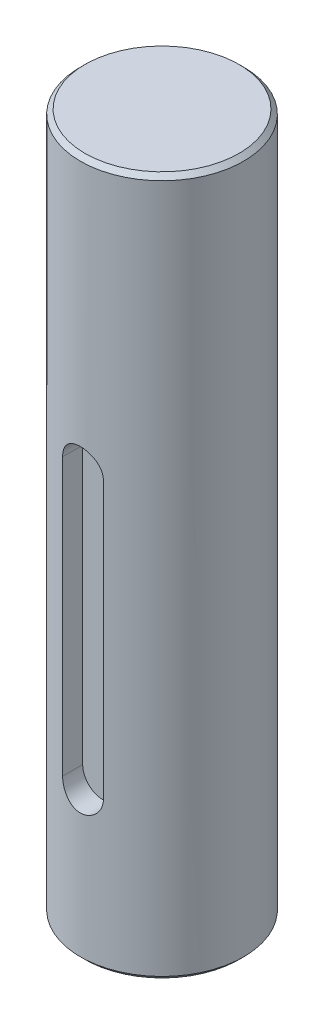
ISO-10303-21;
HEADER;
FILE_DESCRIPTION(('STEP AP214'),'2;1');
FILE_NAME('part.step','',(''),(''),'','','');
FILE_SCHEMA(('AUTOMOTIVE_DESIGN { 1 0 10303 214 1 1 1 1 }'));
ENDSEC;
DATA;
#1=APPLICATION_CONTEXT('core data for automotive mechanical design processes');
#2=APPLICATION_PROTOCOL_DEFINITION('international standard','automotive_design',2000,#1);
#3=PRODUCT_CONTEXT('',#1,'mechanical');
#4=PRODUCT('Part','Part','',(#3));
#5=PRODUCT_RELATED_PRODUCT_CATEGORY('part','',(#4));
#6=PRODUCT_DEFINITION_FORMATION('','',#4);
#7=PRODUCT_DEFINITION_CONTEXT('part definition',#1,'design');
#8=PRODUCT_DEFINITION('design','',#6,#7);
#9=PRODUCT_DEFINITION_SHAPE('','',#8);
#10=(LENGTH_UNIT() NAMED_UNIT(*) SI_UNIT(.MILLI.,.METRE.));
#11=(NAMED_UNIT(*) PLANE_ANGLE_UNIT() SI_UNIT($,.RADIAN.));
#12=(NAMED_UNIT(*) SI_UNIT($,.STERADIAN.) SOLID_ANGLE_UNIT());
#13=UNCERTAINTY_MEASURE_WITH_UNIT(LENGTH_MEASURE(1.E-05),#10,'distance_accuracy_value','');
#14=(GEOMETRIC_REPRESENTATION_CONTEXT(3) GLOBAL_UNCERTAINTY_ASSIGNED_CONTEXT((#13)) GLOBAL_UNIT_ASSIGNED_CONTEXT((#10,
#11,#12)) REPRESENTATION_CONTEXT('',''));
#15=CARTESIAN_POINT('',(0.,0.,0.));
#16=DIRECTION('',(0.,0.,1.));
#17=DIRECTION('',(1.,0.,0.));
#18=AXIS2_PLACEMENT_3D('',#15,#16,#17);
#19=CARTESIAN_POINT('',(0.,154.,0.));
#20=DIRECTION('',(0.,-1.,0.));
#21=DIRECTION('',(0.,0.,-1.));
#22=AXIS2_PLACEMENT_3D('',#19,#20,#21);
#23=CYLINDRICAL_SURFACE('',#22,18.);
#24=CARTESIAN_POINT('',(0.,0.999999999980711,0.));
#25=DIRECTION('',(0.,-1.,0.));
#26=DIRECTION('',(0.,0.,-1.));
#27=AXIS2_PLACEMENT_3D('',#24,#25,#26);
#28=CIRCLE('',#27,18.);
#29=CARTESIAN_POINT('',(0.,0.999999999980711,-18.));
#30=VERTEX_POINT('',#29);
#31=EDGE_CURVE('E11',#30,#30,#28,.F.);
#32=ORIENTED_EDGE('',*,*,#31,.T.);
#33=EDGE_LOOP('',(#32));
#34=FACE_BOUND('',#33,.T.);
#35=CARTESIAN_POINT('',(0.,153.000000000015,0.));
#36=DIRECTION('',(0.,1.,0.));
#37=DIRECTION('',(0.,0.,1.));
#38=AXIS2_PLACEMENT_3D('',#35,#36,#37);
#39=CIRCLE('',#38,18.);
#40=CARTESIAN_POINT('',(0.,153.000000000015,18.));
#41=VERTEX_POINT('',#40);
#42=EDGE_CURVE('E85',#41,#41,#39,.F.);
#43=ORIENTED_EDGE('',*,*,#42,.T.);
#44=EDGE_LOOP('',(#43));
#45=FACE_BOUND('',#44,.T.);
#46=CARTESIAN_POINT('',(-4.5,94.,17.4284250579334));
#47=CARTESIAN_POINT('',(-4.5000156647043,94.1244458014364,17.4284107347967));
#48=CARTESIAN_POINT('',(-4.49483840557996,94.2488863693936,17.4297574723209));
#49=CARTESIAN_POINT('',(-4.47421375808006,94.4968369698889,17.4350686897598));
#50=CARTESIAN_POINT('',(-4.45876809786515,94.6203471554725,17.4390327291847));
#51=CARTESIAN_POINT('',(-4.41776283905938,94.8653171898586,17.4494639227834));
#52=CARTESIAN_POINT('',(-4.39222328142722,94.9867806071818,17.4559261164366));
#53=CARTESIAN_POINT('',(-4.33124877832877,95.2270475755547,17.4711555714416));
#54=CARTESIAN_POINT('',(-4.29581369678078,95.3458510900016,17.4799228644928));
#55=CARTESIAN_POINT('',(-4.21533733996254,95.5799493192975,17.4995040609429));
#56=CARTESIAN_POINT('',(-4.17029908234506,95.6952451234164,17.5103173213078));
#57=CARTESIAN_POINT('',(-4.07096139591949,95.9216078936446,17.5336782518008));
#58=CARTESIAN_POINT('',(-4.01665853231107,96.0326732725987,17.5462265648617));
#59=CARTESIAN_POINT('',(-3.84042452973214,96.3583798526097,17.5859509888199));
#60=CARTESIAN_POINT('',(-3.70510392504746,96.5657169290968,17.6152229521068));
#61=CARTESIAN_POINT('',(-3.39966486867767,96.9589810128218,17.6767345821874));
#62=CARTESIAN_POINT('',(-3.22891361977043,97.1444059808043,17.7090213400346));
#63=CARTESIAN_POINT('',(-2.85874510273362,97.4843504085367,17.7725289539765));
#64=CARTESIAN_POINT('',(-2.65932326118234,97.6388649281499,17.8037496390303));
#65=CARTESIAN_POINT('',(-2.23405492839155,97.9146019655483,17.8621284060258));
#66=CARTESIAN_POINT('',(-2.00787872992062,98.0353301868182,17.889223764723));
#67=CARTESIAN_POINT('',(-1.53766196031827,98.2368606491238,17.935755527242));
#68=CARTESIAN_POINT('',(-1.29362491587987,98.3176707478579,17.9551934382442));
#69=CARTESIAN_POINT('',(-0.799848402628452,98.4354656257204,17.9838855128866));
#70=CARTESIAN_POINT('',(-0.550324398985186,98.4733045238656,17.9933378788006));
#71=CARTESIAN_POINT('',(-0.0482975405889436,98.5067651739817,18.0016847185444));
#72=CARTESIAN_POINT('',(0.204204935769426,98.5023922321947,18.0005805193881));
#73=CARTESIAN_POINT('',(0.699086330195856,98.4521650007781,17.9880856622119));
#74=CARTESIAN_POINT('',(0.941565552325593,98.4072335839201,17.9769238660313));
#75=CARTESIAN_POINT('',(1.41542380536583,98.2786515850882,17.9458349530956));
#76=CARTESIAN_POINT('',(1.64680234464955,98.1949992899888,17.9259074485218));
#77=CARTESIAN_POINT('',(2.09433426664109,97.9905918121828,17.8791746181876));
#78=CARTESIAN_POINT('',(2.31033087642944,97.8695076359326,17.8523086685851));
#79=CARTESIAN_POINT('',(2.71923929648017,97.5939650071392,17.7946186032001));
#80=CARTESIAN_POINT('',(2.9121476221161,97.4395015266303,17.7637938913883));
#81=CARTESIAN_POINT('',(3.27498350962419,97.0965100377574,17.7005464305622));
#82=CARTESIAN_POINT('',(3.44415128659665,96.9071759127181,17.6681030031663));
#83=CARTESIAN_POINT('',(3.67232195999775,96.6038711803696,17.6215806880314));
#84=CARTESIAN_POINT('',(3.74415534342341,96.4994750351049,17.6064208412743));
#85=CARTESIAN_POINT('',(3.87882298183398,96.2848955058637,17.5772430023191));
#86=CARTESIAN_POINT('',(3.94166070999773,96.1747143780201,17.5632245703326));
#87=CARTESIAN_POINT('',(4.05821007067301,95.9486420370628,17.5366624333734));
#88=CARTESIAN_POINT('',(4.11186651083086,95.832721345808,17.5241277778441));
#89=CARTESIAN_POINT('',(4.20917065229615,95.5966139447814,17.5010109161273));
#90=CARTESIAN_POINT('',(4.2528223480413,95.4764289597575,17.4904279310578));
#91=CARTESIAN_POINT('',(4.3297402760017,95.2327441280009,17.4715459663128));
#92=CARTESIAN_POINT('',(4.36301726186849,95.1092478587106,17.463244622722));
#93=CARTESIAN_POINT('',(4.41894832356884,94.8597824767845,17.4491755234153));
#94=CARTESIAN_POINT('',(4.44160737613923,94.7338145515439,17.4434065808167));
#95=CARTESIAN_POINT('',(4.47256077274634,94.5064682669611,17.4354927195271));
#96=CARTESIAN_POINT('',(4.48285352072389,94.4053745650091,17.4328458560488));
#97=CARTESIAN_POINT('',(4.49657044008542,94.202856737473,17.4293104952471));
#98=CARTESIAN_POINT('',(4.50000572417273,94.1014334137009,17.4284191530858));
#99=CARTESIAN_POINT('',(4.5,94.,17.4284250579334));
#100=B_SPLINE_CURVE_WITH_KNOTS('',3,(#46,#47,#48,#49,#50,#51,#52,#53,#54,#55,#56,#57,#58,#59,
#60,#61,#62,#63,#64,#65,#66,#67,#68,#69,#70,#71,#72,#73,#74,#75,#76,#77,#78,#79,#80,#81,#82,#83,
#84,#85,#86,#87,#88,#89,#90,#91,#92,#93,#94,#95,#96,#97,#98,#99),.UNSPECIFIED.,.F.,.F.,(4,2,2,2,
2,2,2,2,2,2,2,2,2,2,2,2,2,2,2,2,2,2,2,2,2,2,4),(0.,0.373214386528958,0.74636597738093,
1.11878038543654,1.49119991512947,1.86350258963563,2.23594359439778,2.98024221125639,
3.7391983634119,4.49827571591239,5.26793824440658,6.03744920794513,6.79138149317564,
7.54521900653478,8.28232437155343,9.01946235139874,9.76327275025296,10.5071952683808,
11.2711741540404,11.653682416459,12.0360425936688,12.4206261680929,12.8050559273334,
13.189085880254,13.5729356538142,13.8776487070531,14.1818675624784),.UNSPECIFIED.);
#101=CARTESIAN_POINT('',(-4.50000000000001,94.,17.4284250579334));
#102=VERTEX_POINT('',#101);
#103=CARTESIAN_POINT('',(4.5,94.,17.4284250579334));
#104=VERTEX_POINT('',#103);
#105=EDGE_CURVE('E88',#102,#104,#100,.T.);
#106=ORIENTED_EDGE('',*,*,#105,.T.);
#107=DIRECTION('',(0.,-1.,0.));
#108=VECTOR('',#107,1.);
#109=CARTESIAN_POINT('',(4.5,154.,17.4284250579334));
#110=LINE('',#109,#108);
#111=CARTESIAN_POINT('',(4.5,33.,17.4284250579334));
#112=VERTEX_POINT('',#111);
#113=EDGE_CURVE('E77',#104,#112,#110,.T.);
#114=ORIENTED_EDGE('',*,*,#113,.T.);
#115=CARTESIAN_POINT('',(4.50000000000001,33.,17.4284250579334));
#116=CARTESIAN_POINT('',(4.50001566470431,32.8755541985636,17.4284107347967));
#117=CARTESIAN_POINT('',(4.49483840557997,32.7511136306064,17.4297574723209));
#118=CARTESIAN_POINT('',(4.47421375808006,32.5031630301111,17.4350686897598));
#119=CARTESIAN_POINT('',(4.45876809786516,32.3796528445275,17.4390327291847));
#120=CARTESIAN_POINT('',(4.41776283905938,32.1346828101414,17.4494639227834));
#121=CARTESIAN_POINT('',(4.39222328142722,32.0132193928182,17.4559261164366));
#122=CARTESIAN_POINT('',(4.33124877832877,31.7729524244453,17.4711555714416));
#123=CARTESIAN_POINT('',(4.29581369678078,31.6541489099984,17.4799228644928));
#124=CARTESIAN_POINT('',(4.21533733996254,31.4200506807025,17.4995040609429));
#125=CARTESIAN_POINT('',(4.17029908234507,31.3047548765836,17.5103173213078));
#126=CARTESIAN_POINT('',(4.0709613959195,31.0783921063554,17.5336782518008));
#127=CARTESIAN_POINT('',(4.01665853231108,30.9673267274013,17.5462265648617));
#128=CARTESIAN_POINT('',(3.84042452973214,30.6416201473903,17.5859509888199));
#129=CARTESIAN_POINT('',(3.70510392504746,30.4342830709032,17.6152229521068));
#130=CARTESIAN_POINT('',(3.39966486867767,30.0410189871782,17.6767345821874));
#131=CARTESIAN_POINT('',(3.22891361977043,29.8555940191957,17.7090213400346));
#132=CARTESIAN_POINT('',(2.85874510273362,29.5156495914633,17.7725289539765));
#133=CARTESIAN_POINT('',(2.65932326118235,29.3611350718501,17.8037496390303));
#134=CARTESIAN_POINT('',(2.23405492839155,29.0853980344517,17.8621284060258));
#135=CARTESIAN_POINT('',(2.00787872992062,28.9646698131818,17.889223764723));
#136=CARTESIAN_POINT('',(1.53766196031827,28.7631393508762,17.935755527242));
#137=CARTESIAN_POINT('',(1.29362491587988,28.6823292521421,17.9551934382442));
#138=CARTESIAN_POINT('',(0.799848402628461,28.5645343742796,17.9838855128866));
#139=CARTESIAN_POINT('',(0.550324398985194,28.5266954761344,17.9933378788006));
#140=CARTESIAN_POINT('',(0.0482975405889505,28.4932348260183,18.0016847185444));
#141=CARTESIAN_POINT('',(-0.204204935769418,28.4976077678053,18.0005805193881));
#142=CARTESIAN_POINT('',(-0.699086330195849,28.5478349992219,17.9880856622119));
#143=CARTESIAN_POINT('',(-0.941565552325586,28.5927664160799,17.9769238660313));
#144=CARTESIAN_POINT('',(-1.41542380536582,28.7213484149118,17.9458349530956));
#145=CARTESIAN_POINT('',(-1.64680234464954,28.8050007100112,17.9259074485218));
#146=CARTESIAN_POINT('',(-2.09433426664108,29.0094081878172,17.8791746181876));
#147=CARTESIAN_POINT('',(-2.31033087642943,29.1304923640674,17.8523086685851));
#148=CARTESIAN_POINT('',(-2.71923929648017,29.4060349928608,17.7946186032001));
#149=CARTESIAN_POINT('',(-2.9121476221161,29.5604984733697,17.7637938913883));
#150=CARTESIAN_POINT('',(-3.27498350962418,29.9034899622426,17.7005464305622));
#151=CARTESIAN_POINT('',(-3.44415128659664,30.0928240872819,17.6681030031663));
#152=CARTESIAN_POINT('',(-3.67232195999774,30.3961288196304,17.6215806880314));
#153=CARTESIAN_POINT('',(-3.7441553434234,30.5005249648951,17.6064208412743));
#154=CARTESIAN_POINT('',(-3.87882298183397,30.7151044941363,17.5772430023191));
#155=CARTESIAN_POINT('',(-3.94166070999772,30.8252856219799,17.5632245703326));
#156=CARTESIAN_POINT('',(-4.058210070673,31.0513579629372,17.5366624333734));
#157=CARTESIAN_POINT('',(-4.11186651083084,31.167278654192,17.5241277778441));
#158=CARTESIAN_POINT('',(-4.20917065229614,31.4033860552186,17.5010109161273));
#159=CARTESIAN_POINT('',(-4.25282234804129,31.5235710402425,17.4904279310578));
#160=CARTESIAN_POINT('',(-4.32974027600169,31.7672558719991,17.4715459663128));
#161=CARTESIAN_POINT('',(-4.36301726186848,31.8907521412894,17.463244622722));
#162=CARTESIAN_POINT('',(-4.41894832356883,32.1402175232154,17.4491755234153));
#163=CARTESIAN_POINT('',(-4.44160737613922,32.2661854484561,17.4434065808167));
#164=CARTESIAN_POINT('',(-4.47256077274633,32.4935317330389,17.4354927195271));
#165=CARTESIAN_POINT('',(-4.48285352072388,32.5946254349909,17.4328458560488));
#166=CARTESIAN_POINT('',(-4.49657044008541,32.797143262527,17.4293104952471));
#167=CARTESIAN_POINT('',(-4.50000572417272,32.8985665862991,17.4284191530858));
#168=CARTESIAN_POINT('',(-4.49999999999999,33.,17.4284250579334));
#169=B_SPLINE_CURVE_WITH_KNOTS('',3,(#115,#116,#117,#118,#119,#120,#121,#122,#123,#124,#125,
#126,#127,#128,#129,#130,#131,#132,#133,#134,#135,#136,#137,#138,#139,#140,#141,#142,#143,#144,
#145,#146,#147,#148,#149,#150,#151,#152,#153,#154,#155,#156,#157,#158,#159,#160,#161,#162,#163,
#164,#165,#166,#167,#168),.UNSPECIFIED.,.F.,.F.,(4,2,2,2,2,2,2,2,2,2,2,2,2,2,2,2,2,2,2,2,2,2,2,
2,2,2,4),(0.,0.373214386528965,0.74636597738093,1.11878038543655,1.49119991512947,
1.86350258963563,2.23594359439777,2.9802422112564,3.73919836341191,4.4982757159124,
5.26793824440659,6.03744920794513,6.79138149317564,7.54521900653477,8.28232437155343,
9.01946235139874,9.76327275025296,10.5071952683808,11.2711741540404,11.653682416459,
12.0360425936688,12.4206261680929,12.8050559273334,13.189085880254,13.5729356538142,
13.8776487070531,14.1818675624785),.UNSPECIFIED.);
#170=CARTESIAN_POINT('',(-4.49999999999999,33.,17.4284250579334));
#171=VERTEX_POINT('',#170);
#172=EDGE_CURVE('E97',#112,#171,#169,.T.);
#173=ORIENTED_EDGE('',*,*,#172,.T.);
#174=DIRECTION('',(0.,-1.,0.));
#175=VECTOR('',#174,1.);
#176=CARTESIAN_POINT('',(-4.50000000000001,154.,17.4284250579334));
#177=LINE('',#176,#175);
#178=EDGE_CURVE('E93',#171,#102,#177,.F.);
#179=ORIENTED_EDGE('',*,*,#178,.T.);
#180=EDGE_LOOP('',(#106,#114,#173,#179));
#181=FACE_BOUND('',#180,.T.);
#182=ADVANCED_FACE('F38',(#34,#45,#181),#23,.T.);
#183=CARTESIAN_POINT('',(18.,154.,0.));
#184=DIRECTION('',(0.,1.,0.));
#185=DIRECTION('',(0.,0.,1.));
#186=AXIS2_PLACEMENT_3D('',#183,#184,#185);
#187=PLANE('',#186);
#188=CARTESIAN_POINT('',(0.,154.,0.));
#189=DIRECTION('',(0.,1.,0.));
#190=DIRECTION('',(0.,0.,1.));
#191=AXIS2_PLACEMENT_3D('',#188,#189,#190);
#192=CIRCLE('',#191,16.999999999992);
#193=CARTESIAN_POINT('',(0.,154.,16.999999999992));
#194=VERTEX_POINT('',#193);
#195=EDGE_CURVE('E144',#194,#194,#192,.T.);
#196=ORIENTED_EDGE('',*,*,#195,.T.);
#197=EDGE_LOOP('',(#196));
#198=FACE_BOUND('',#197,.T.);
#199=ADVANCED_FACE('F132',(#198),#187,.T.);
#200=CARTESIAN_POINT('',(0.,0.,0.));
#201=DIRECTION('',(0.,-1.,0.));
#202=DIRECTION('',(0.,0.,-1.));
#203=AXIS2_PLACEMENT_3D('',#200,#201,#202);
#204=PLANE('',#203);
#205=CARTESIAN_POINT('',(0.,0.,0.));
#206=DIRECTION('',(0.,-1.,0.));
#207=DIRECTION('',(0.,0.,-1.));
#208=AXIS2_PLACEMENT_3D('',#205,#206,#207);
#209=CIRCLE('',#208,16.9999999999949);
#210=CARTESIAN_POINT('',(0.,0.,-16.9999999999949));
#211=VERTEX_POINT('',#210);
#212=EDGE_CURVE('E45',#211,#211,#209,.T.);
#213=ORIENTED_EDGE('',*,*,#212,.T.);
#214=EDGE_LOOP('',(#213));
#215=FACE_BOUND('',#214,.T.);
#216=ADVANCED_FACE('F137',(#215),#204,.T.);
#217=CARTESIAN_POINT('',(0.,94.,18.001));
#218=DIRECTION('',(0.,0.,-1.));
#219=DIRECTION('',(-1.,0.,0.));
#220=AXIS2_PLACEMENT_3D('',#217,#218,#219);
#221=CYLINDRICAL_SURFACE('',#220,4.5);
#222=DIRECTION('',(0.,0.,-1.));
#223=VECTOR('',#222,1.);
#224=CARTESIAN_POINT('',(-4.5,94.,18.001));
#225=LINE('',#224,#223);
#226=CARTESIAN_POINT('',(-4.5,94.,13.));
#227=VERTEX_POINT('',#226);
#228=EDGE_CURVE('E60',#102,#227,#225,.T.);
#229=ORIENTED_EDGE('',*,*,#228,.T.);
#230=CARTESIAN_POINT('',(0.,94.,13.));
#231=DIRECTION('',(0.,0.,-1.));
#232=DIRECTION('',(-1.,0.,0.));
#233=AXIS2_PLACEMENT_3D('',#230,#231,#232);
#234=CIRCLE('',#233,4.5);
#235=CARTESIAN_POINT('',(4.5,94.,13.));
#236=VERTEX_POINT('',#235);
#237=EDGE_CURVE('E89',#227,#236,#234,.T.);
#238=ORIENTED_EDGE('',*,*,#237,.T.);
#239=DIRECTION('',(0.,0.,-1.));
#240=VECTOR('',#239,1.);
#241=CARTESIAN_POINT('',(4.5,94.,18.001));
#242=LINE('',#241,#240);
#243=EDGE_CURVE('E80',#104,#236,#242,.T.);
#244=ORIENTED_EDGE('',*,*,#243,.F.);
#245=ORIENTED_EDGE('',*,*,#105,.F.);
#246=EDGE_LOOP('',(#229,#238,#244,#245));
#247=FACE_BOUND('',#246,.T.);
#248=ADVANCED_FACE('F87',(#247),#221,.F.);
#249=CARTESIAN_POINT('',(-4.49999999999999,33.,18.001));
#250=DIRECTION('',(-1.,0.,0.));
#251=DIRECTION('',(0.,-1.,0.));
#252=AXIS2_PLACEMENT_3D('',#249,#250,#251);
#253=PLANE('',#252);
#254=DIRECTION('',(0.,0.,-1.));
#255=VECTOR('',#254,1.);
#256=CARTESIAN_POINT('',(-4.49999999999999,33.,18.001));
#257=LINE('',#256,#255);
#258=CARTESIAN_POINT('',(-4.49999999999999,33.,13.));
#259=VERTEX_POINT('',#258);
#260=EDGE_CURVE('E212',#171,#259,#257,.T.);
#261=ORIENTED_EDGE('',*,*,#260,.T.);
#262=DIRECTION('',(0.,1.,0.));
#263=VECTOR('',#262,1.);
#264=CARTESIAN_POINT('',(-4.49999999999999,33.,13.));
#265=LINE('',#264,#263);
#266=EDGE_CURVE('E90',#259,#227,#265,.T.);
#267=ORIENTED_EDGE('',*,*,#266,.T.);
#268=ORIENTED_EDGE('',*,*,#228,.F.);
#269=ORIENTED_EDGE('',*,*,#178,.F.);
#270=EDGE_LOOP('',(#261,#267,#268,#269));
#271=FACE_BOUND('',#270,.T.);
#272=ADVANCED_FACE('F124',(#271),#253,.F.);
#273=CARTESIAN_POINT('',(0.,33.,18.001));
#274=DIRECTION('',(0.,0.,-1.));
#275=DIRECTION('',(-1.,0.,0.));
#276=AXIS2_PLACEMENT_3D('',#273,#274,#275);
#277=CYLINDRICAL_SURFACE('',#276,4.5);
#278=DIRECTION('',(0.,0.,-1.));
#279=VECTOR('',#278,1.);
#280=CARTESIAN_POINT('',(4.50000000000001,33.,18.001));
#281=LINE('',#280,#279);
#282=CARTESIAN_POINT('',(4.50000000000001,33.,13.));
#283=VERTEX_POINT('',#282);
#284=EDGE_CURVE('E52',#112,#283,#281,.T.);
#285=ORIENTED_EDGE('',*,*,#284,.T.);
#286=CARTESIAN_POINT('',(0.,33.,13.));
#287=DIRECTION('',(0.,0.,-1.));
#288=DIRECTION('',(-1.,0.,0.));
#289=AXIS2_PLACEMENT_3D('',#286,#287,#288);
#290=CIRCLE('',#289,4.5);
#291=EDGE_CURVE('E217',#283,#259,#290,.T.);
#292=ORIENTED_EDGE('',*,*,#291,.T.);
#293=ORIENTED_EDGE('',*,*,#260,.F.);
#294=ORIENTED_EDGE('',*,*,#172,.F.);
#295=EDGE_LOOP('',(#285,#292,#293,#294));
#296=FACE_BOUND('',#295,.T.);
#297=ADVANCED_FACE('F121',(#296),#277,.F.);
#298=CARTESIAN_POINT('',(4.5,94.,18.001));
#299=DIRECTION('',(1.,0.,0.));
#300=DIRECTION('',(0.,1.,0.));
#301=AXIS2_PLACEMENT_3D('',#298,#299,#300);
#302=PLANE('',#301);
#303=ORIENTED_EDGE('',*,*,#243,.T.);
#304=DIRECTION('',(0.,-1.,0.));
#305=VECTOR('',#304,1.);
#306=CARTESIAN_POINT('',(4.5,94.,13.));
#307=LINE('',#306,#305);
#308=EDGE_CURVE('E95',#236,#283,#307,.T.);
#309=ORIENTED_EDGE('',*,*,#308,.T.);
#310=ORIENTED_EDGE('',*,*,#284,.F.);
#311=ORIENTED_EDGE('',*,*,#113,.F.);
#312=EDGE_LOOP('',(#303,#309,#310,#311));
#313=FACE_BOUND('',#312,.T.);
#314=ADVANCED_FACE('F79',(#313),#302,.F.);
#315=CARTESIAN_POINT('',(0.,94.,13.));
#316=DIRECTION('',(0.,0.,-1.));
#317=DIRECTION('',(-1.,0.,0.));
#318=AXIS2_PLACEMENT_3D('',#315,#316,#317);
#319=PLANE('',#318);
#320=ORIENTED_EDGE('',*,*,#237,.F.);
#321=ORIENTED_EDGE('',*,*,#266,.F.);
#322=ORIENTED_EDGE('',*,*,#291,.F.);
#323=ORIENTED_EDGE('',*,*,#308,.F.);
#324=EDGE_LOOP('',(#320,#321,#322,#323));
#325=FACE_BOUND('',#324,.T.);
#326=ADVANCED_FACE('F114',(#325),#319,.F.);
#327=CARTESIAN_POINT('',(0.,153.000000000015,0.));
#328=DIRECTION('',(0.,-1.,0.));
#329=DIRECTION('',(0.,0.,-1.));
#330=AXIS2_PLACEMENT_3D('',#327,#328,#329);
#331=CONICAL_SURFACE('',#330,18.,0.785398163409099);
#332=ORIENTED_EDGE('',*,*,#195,.F.);
#333=EDGE_LOOP('',(#332));
#334=FACE_BOUND('',#333,.T.);
#335=ORIENTED_EDGE('',*,*,#42,.F.);
#336=EDGE_LOOP('',(#335));
#337=FACE_BOUND('',#336,.T.);
#338=ADVANCED_FACE('F112',(#334,#337),#331,.T.);
#339=CARTESIAN_POINT('',(0.,0.,0.));
#340=DIRECTION('',(0.,1.,0.));
#341=DIRECTION('',(0.,0.,1.));
#342=AXIS2_PLACEMENT_3D('',#339,#340,#341);
#343=CONICAL_SURFACE('',#342,16.9999999999949,0.785398163409626);
#344=ORIENTED_EDGE('',*,*,#31,.F.);
#345=EDGE_LOOP('',(#344));
#346=FACE_BOUND('',#345,.T.);
#347=ORIENTED_EDGE('',*,*,#212,.F.);
#348=EDGE_LOOP('',(#347));
#349=FACE_BOUND('',#348,.T.);
#350=ADVANCED_FACE('F152',(#346,#349),#343,.T.);
#351=CLOSED_SHELL('',(#182,#199,#216,#248,#272,#297,#314,#326,#338,#350));
#352=MANIFOLD_SOLID_BREP('B2',#351);
#353=ADVANCED_BREP_SHAPE_REPRESENTATION('',(#18,#352),#14);
#354=SHAPE_DEFINITION_REPRESENTATION(#9,#353);
ENDSEC;
END-ISO-10303-21;
